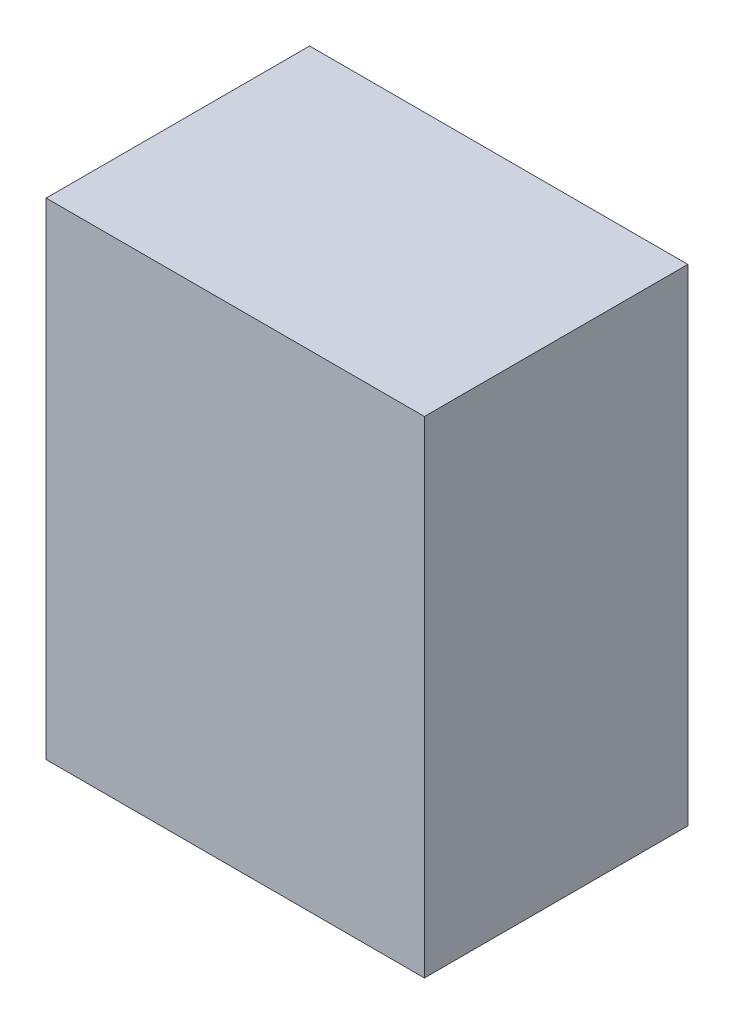
ISO-10303-21;
HEADER;
FILE_DESCRIPTION(('STEP AP214'),'2;1');
FILE_NAME('part.step','',(''),(''),'','','');
FILE_SCHEMA(('AUTOMOTIVE_DESIGN { 1 0 10303 214 1 1 1 1 }'));
ENDSEC;
DATA;
#1=APPLICATION_CONTEXT('core data for automotive mechanical design processes');
#2=APPLICATION_PROTOCOL_DEFINITION('international standard','automotive_design',2000,#1);
#3=PRODUCT_CONTEXT('',#1,'mechanical');
#4=PRODUCT('Part','Part','',(#3));
#5=PRODUCT_RELATED_PRODUCT_CATEGORY('part','',(#4));
#6=PRODUCT_DEFINITION_FORMATION('','',#4);
#7=PRODUCT_DEFINITION_CONTEXT('part definition',#1,'design');
#8=PRODUCT_DEFINITION('design','',#6,#7);
#9=PRODUCT_DEFINITION_SHAPE('','',#8);
#10=(LENGTH_UNIT() NAMED_UNIT(*) SI_UNIT(.MILLI.,.METRE.));
#11=(NAMED_UNIT(*) PLANE_ANGLE_UNIT() SI_UNIT($,.RADIAN.));
#12=(NAMED_UNIT(*) SI_UNIT($,.STERADIAN.) SOLID_ANGLE_UNIT());
#13=UNCERTAINTY_MEASURE_WITH_UNIT(LENGTH_MEASURE(1.E-05),#10,'distance_accuracy_value','');
#14=(GEOMETRIC_REPRESENTATION_CONTEXT(3) GLOBAL_UNCERTAINTY_ASSIGNED_CONTEXT((#13)) GLOBAL_UNIT_ASSIGNED_CONTEXT((#10,
#11,#12)) REPRESENTATION_CONTEXT('',''));
#15=CARTESIAN_POINT('',(0.,0.,0.));
#16=DIRECTION('',(0.,0.,1.));
#17=DIRECTION('',(1.,0.,0.));
#18=AXIS2_PLACEMENT_3D('',#15,#16,#17);
#19=CARTESIAN_POINT('',(28.,36.,39.));
#20=DIRECTION('',(-1.,0.,0.));
#21=DIRECTION('',(0.,-1.,0.));
#22=AXIS2_PLACEMENT_3D('',#19,#20,#21);
#23=PLANE('',#22);
#24=DIRECTION('',(0.,1.,0.));
#25=VECTOR('',#24,1.);
#26=CARTESIAN_POINT('',(28.,36.,0.));
#27=LINE('',#26,#25);
#28=CARTESIAN_POINT('',(28.,-36.,0.));
#29=VERTEX_POINT('',#28);
#30=CARTESIAN_POINT('',(28.,36.,0.));
#31=VERTEX_POINT('',#30);
#32=EDGE_CURVE('E97',#29,#31,#27,.T.);
#33=ORIENTED_EDGE('',*,*,#32,.T.);
#34=DIRECTION('',(0.,0.,-1.));
#35=VECTOR('',#34,1.);
#36=CARTESIAN_POINT('',(28.,36.,39.));
#37=LINE('',#36,#35);
#38=CARTESIAN_POINT('',(28.,36.,39.));
#39=VERTEX_POINT('',#38);
#40=EDGE_CURVE('E11',#39,#31,#37,.T.);
#41=ORIENTED_EDGE('',*,*,#40,.F.);
#42=DIRECTION('',(0.,1.,0.));
#43=VECTOR('',#42,1.);
#44=CARTESIAN_POINT('',(28.,36.,39.));
#45=LINE('',#44,#43);
#46=CARTESIAN_POINT('',(28.,-36.,39.));
#47=VERTEX_POINT('',#46);
#48=EDGE_CURVE('E85',#47,#39,#45,.T.);
#49=ORIENTED_EDGE('',*,*,#48,.F.);
#50=DIRECTION('',(0.,0.,-1.));
#51=VECTOR('',#50,1.);
#52=CARTESIAN_POINT('',(28.,-36.,39.));
#53=LINE('',#52,#51);
#54=EDGE_CURVE('E93',#47,#29,#53,.T.);
#55=ORIENTED_EDGE('',*,*,#54,.T.);
#56=EDGE_LOOP('',(#33,#41,#49,#55));
#57=FACE_BOUND('',#56,.T.);
#58=ADVANCED_FACE('F34',(#57),#23,.F.);
#59=CARTESIAN_POINT('',(-28.,36.,39.));
#60=DIRECTION('',(0.,-1.,0.));
#61=DIRECTION('',(0.,0.,-1.));
#62=AXIS2_PLACEMENT_3D('',#59,#60,#61);
#63=PLANE('',#62);
#64=DIRECTION('',(-1.,0.,0.));
#65=VECTOR('',#64,1.);
#66=CARTESIAN_POINT('',(-28.,36.,0.));
#67=LINE('',#66,#65);
#68=CARTESIAN_POINT('',(-28.,36.,0.));
#69=VERTEX_POINT('',#68);
#70=EDGE_CURVE('E89',#31,#69,#67,.T.);
#71=ORIENTED_EDGE('',*,*,#70,.T.);
#72=DIRECTION('',(0.,0.,-1.));
#73=VECTOR('',#72,1.);
#74=CARTESIAN_POINT('',(-28.,36.,39.));
#75=LINE('',#74,#73);
#76=CARTESIAN_POINT('',(-28.,36.,39.));
#77=VERTEX_POINT('',#76);
#78=EDGE_CURVE('E42',#77,#69,#75,.T.);
#79=ORIENTED_EDGE('',*,*,#78,.F.);
#80=DIRECTION('',(-1.,0.,0.));
#81=VECTOR('',#80,1.);
#82=CARTESIAN_POINT('',(-28.,36.,39.));
#83=LINE('',#82,#81);
#84=EDGE_CURVE('E80',#39,#77,#83,.T.);
#85=ORIENTED_EDGE('',*,*,#84,.F.);
#86=ORIENTED_EDGE('',*,*,#40,.T.);
#87=EDGE_LOOP('',(#71,#79,#85,#86));
#88=FACE_BOUND('',#87,.T.);
#89=ADVANCED_FACE('F88',(#88),#63,.F.);
#90=CARTESIAN_POINT('',(-28.,36.,39.));
#91=DIRECTION('',(1.,0.,0.));
#92=DIRECTION('',(0.,1.,0.));
#93=AXIS2_PLACEMENT_3D('',#90,#91,#92);
#94=PLANE('',#93);
#95=DIRECTION('',(0.,-1.,0.));
#96=VECTOR('',#95,1.);
#97=CARTESIAN_POINT('',(-28.,36.,0.));
#98=LINE('',#97,#96);
#99=CARTESIAN_POINT('',(-28.,-36.,0.));
#100=VERTEX_POINT('',#99);
#101=EDGE_CURVE('E67',#69,#100,#98,.T.);
#102=ORIENTED_EDGE('',*,*,#101,.T.);
#103=DIRECTION('',(0.,0.,-1.));
#104=VECTOR('',#103,1.);
#105=CARTESIAN_POINT('',(-28.,-36.,39.));
#106=LINE('',#105,#104);
#107=CARTESIAN_POINT('',(-28.,-36.,39.));
#108=VERTEX_POINT('',#107);
#109=EDGE_CURVE('E90',#108,#100,#106,.T.);
#110=ORIENTED_EDGE('',*,*,#109,.F.);
#111=DIRECTION('',(0.,-1.,0.));
#112=VECTOR('',#111,1.);
#113=CARTESIAN_POINT('',(-28.,36.,39.));
#114=LINE('',#113,#112);
#115=EDGE_CURVE('E83',#77,#108,#114,.T.);
#116=ORIENTED_EDGE('',*,*,#115,.F.);
#117=ORIENTED_EDGE('',*,*,#78,.T.);
#118=EDGE_LOOP('',(#102,#110,#116,#117));
#119=FACE_BOUND('',#118,.T.);
#120=ADVANCED_FACE('F91',(#119),#94,.F.);
#121=CARTESIAN_POINT('',(-28.,-36.,39.));
#122=DIRECTION('',(0.,1.,0.));
#123=DIRECTION('',(0.,0.,1.));
#124=AXIS2_PLACEMENT_3D('',#121,#122,#123);
#125=PLANE('',#124);
#126=DIRECTION('',(1.,0.,0.));
#127=VECTOR('',#126,1.);
#128=CARTESIAN_POINT('',(-28.,-36.,0.));
#129=LINE('',#128,#127);
#130=EDGE_CURVE('E73',#100,#29,#129,.T.);
#131=ORIENTED_EDGE('',*,*,#130,.T.);
#132=ORIENTED_EDGE('',*,*,#54,.F.);
#133=DIRECTION('',(1.,0.,0.));
#134=VECTOR('',#133,1.);
#135=CARTESIAN_POINT('',(-28.,-36.,39.));
#136=LINE('',#135,#134);
#137=EDGE_CURVE('E50',#108,#47,#136,.T.);
#138=ORIENTED_EDGE('',*,*,#137,.F.);
#139=ORIENTED_EDGE('',*,*,#109,.T.);
#140=EDGE_LOOP('',(#131,#132,#138,#139));
#141=FACE_BOUND('',#140,.T.);
#142=ADVANCED_FACE('F104',(#141),#125,.F.);
#143=CARTESIAN_POINT('',(0.,0.,39.));
#144=DIRECTION('',(0.,0.,1.));
#145=DIRECTION('',(1.,0.,0.));
#146=AXIS2_PLACEMENT_3D('',#143,#144,#145);
#147=PLANE('',#146);
#148=ORIENTED_EDGE('',*,*,#48,.T.);
#149=ORIENTED_EDGE('',*,*,#84,.T.);
#150=ORIENTED_EDGE('',*,*,#115,.T.);
#151=ORIENTED_EDGE('',*,*,#137,.T.);
#152=EDGE_LOOP('',(#148,#149,#150,#151));
#153=FACE_BOUND('',#152,.T.);
#154=ADVANCED_FACE('F81',(#153),#147,.T.);
#155=CARTESIAN_POINT('',(0.,0.,0.));
#156=DIRECTION('',(0.,0.,1.));
#157=DIRECTION('',(1.,0.,0.));
#158=AXIS2_PLACEMENT_3D('',#155,#156,#157);
#159=PLANE('',#158);
#160=ORIENTED_EDGE('',*,*,#32,.F.);
#161=ORIENTED_EDGE('',*,*,#130,.F.);
#162=ORIENTED_EDGE('',*,*,#101,.F.);
#163=ORIENTED_EDGE('',*,*,#70,.F.);
#164=EDGE_LOOP('',(#160,#161,#162,#163));
#165=FACE_BOUND('',#164,.T.);
#166=ADVANCED_FACE('F107',(#165),#159,.F.);
#167=CLOSED_SHELL('',(#58,#89,#120,#142,#154,#166));
#168=MANIFOLD_SOLID_BREP('B2',#167);
#169=ADVANCED_BREP_SHAPE_REPRESENTATION('',(#18,#168),#14);
#170=SHAPE_DEFINITION_REPRESENTATION(#9,#169);
ENDSEC;
END-ISO-10303-21;
